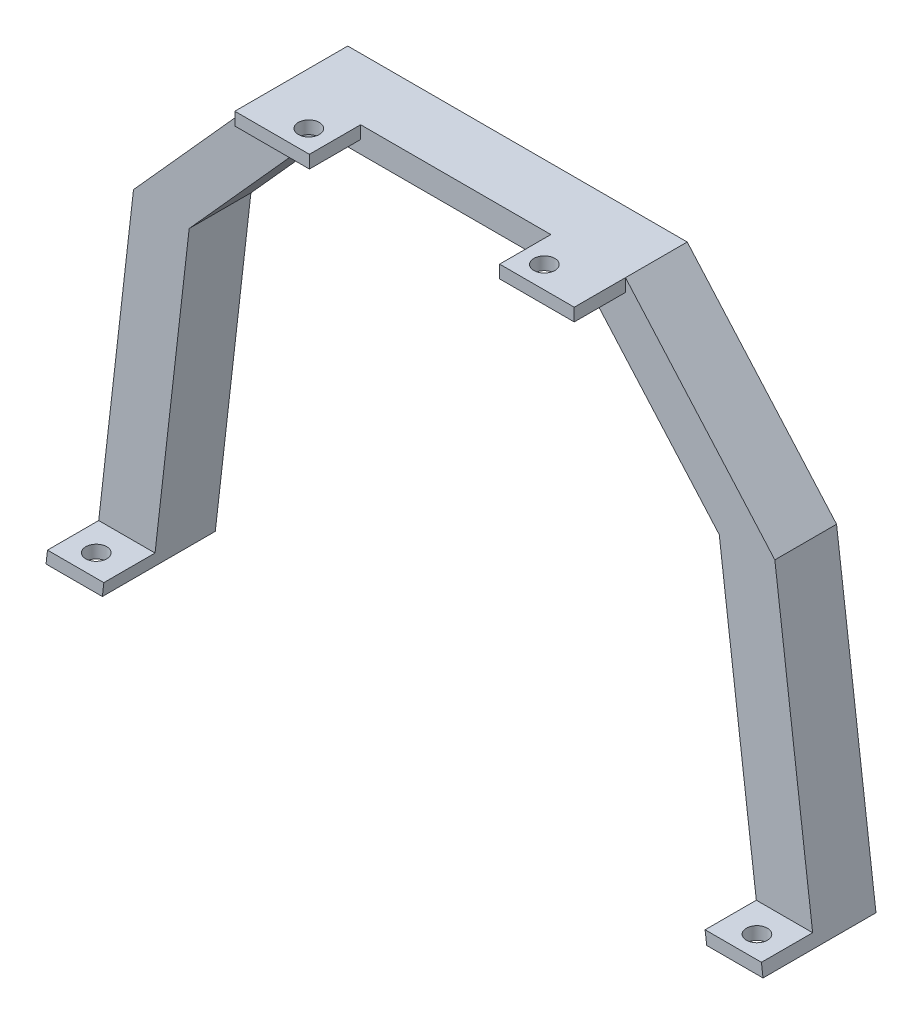
ISO-10303-21;
HEADER;
FILE_DESCRIPTION(('STEP AP214'),'2;1');
FILE_NAME('part.step','',(''),(''),'','','');
FILE_SCHEMA(('AUTOMOTIVE_DESIGN { 1 0 10303 214 1 1 1 1 }'));
ENDSEC;
DATA;
#1=APPLICATION_CONTEXT('core data for automotive mechanical design processes');
#2=APPLICATION_PROTOCOL_DEFINITION('international standard','automotive_design',2000,#1);
#3=PRODUCT_CONTEXT('',#1,'mechanical');
#4=PRODUCT('Part','Part','',(#3));
#5=PRODUCT_RELATED_PRODUCT_CATEGORY('part','',(#4));
#6=PRODUCT_DEFINITION_FORMATION('','',#4);
#7=PRODUCT_DEFINITION_CONTEXT('part definition',#1,'design');
#8=PRODUCT_DEFINITION('design','',#6,#7);
#9=PRODUCT_DEFINITION_SHAPE('','',#8);
#10=(LENGTH_UNIT() NAMED_UNIT(*) SI_UNIT(.MILLI.,.METRE.));
#11=(NAMED_UNIT(*) PLANE_ANGLE_UNIT() SI_UNIT($,.RADIAN.));
#12=(NAMED_UNIT(*) SI_UNIT($,.STERADIAN.) SOLID_ANGLE_UNIT());
#13=UNCERTAINTY_MEASURE_WITH_UNIT(LENGTH_MEASURE(1.E-05),#10,'distance_accuracy_value','');
#14=(GEOMETRIC_REPRESENTATION_CONTEXT(3) GLOBAL_UNCERTAINTY_ASSIGNED_CONTEXT((#13)) GLOBAL_UNIT_ASSIGNED_CONTEXT((#10,
#11,#12)) REPRESENTATION_CONTEXT('',''));
#15=CARTESIAN_POINT('',(0.,0.,0.));
#16=DIRECTION('',(0.,0.,1.));
#17=DIRECTION('',(1.,0.,0.));
#18=AXIS2_PLACEMENT_3D('',#15,#16,#17);
#19=CARTESIAN_POINT('',(25.8602318139897,95.,-2.05512577458606));
#20=DIRECTION('',(0.,1.,0.));
#21=DIRECTION('',(-1.,0.,0.));
#22=AXIS2_PLACEMENT_3D('',#19,#20,#21);
#23=PLANE('',#22);
#24=CARTESIAN_POINT('',(82.,95.,15.6873727087576));
#25=DIRECTION('',(0.,1.,0.));
#26=DIRECTION('',(0.,0.,1.));
#27=AXIS2_PLACEMENT_3D('',#24,#25,#26);
#28=CIRCLE('',#27,2.04999999999999);
#29=CARTESIAN_POINT('',(82.,95.,17.7373727087576));
#30=VERTEX_POINT('',#29);
#31=EDGE_CURVE('E394',#30,#30,#28,.F.);
#32=ORIENTED_EDGE('',*,*,#31,.T.);
#33=EDGE_LOOP('',(#32));
#34=FACE_BOUND('',#33,.T.);
#35=DIRECTION('',(0.,0.,1.));
#36=VECTOR('',#35,1.);
#37=CARTESIAN_POINT('',(25.8602318139897,95.,-2.05512577458606));
#38=LINE('',#37,#36);
#39=CARTESIAN_POINT('',(25.8602318139897,95.,-2.05512577458606));
#40=VERTEX_POINT('',#39);
#41=CARTESIAN_POINT('',(25.8602318139897,95.,10.));
#42=VERTEX_POINT('',#41);
#43=EDGE_CURVE('E369',#40,#42,#38,.T.);
#44=ORIENTED_EDGE('',*,*,#43,.T.);
#45=DIRECTION('',(0.,0.,-1.));
#46=VECTOR('',#45,1.);
#47=CARTESIAN_POINT('',(25.8602318139897,95.,20.));
#48=LINE('',#47,#46);
#49=CARTESIAN_POINT('',(25.8602318139897,95.,20.));
#50=VERTEX_POINT('',#49);
#51=EDGE_CURVE('E243',#50,#42,#48,.T.);
#52=ORIENTED_EDGE('',*,*,#51,.F.);
#53=DIRECTION('',(1.,0.,0.));
#54=VECTOR('',#53,1.);
#55=CARTESIAN_POINT('',(25.8602318139897,95.,20.));
#56=LINE('',#55,#54);
#57=CARTESIAN_POINT('',(40.428513699139,95.,20.));
#58=VERTEX_POINT('',#57);
#59=EDGE_CURVE('E241',#50,#58,#56,.T.);
#60=ORIENTED_EDGE('',*,*,#59,.T.);
#61=DIRECTION('',(0.,0.,-1.));
#62=VECTOR('',#61,1.);
#63=CARTESIAN_POINT('',(40.428513699139,95.,20.));
#64=LINE('',#63,#62);
#65=CARTESIAN_POINT('',(40.428513699139,95.,10.));
#66=VERTEX_POINT('',#65);
#67=EDGE_CURVE('E198',#58,#66,#64,.T.);
#68=ORIENTED_EDGE('',*,*,#67,.T.);
#69=DIRECTION('',(-1.,0.,0.));
#70=VECTOR('',#69,1.);
#71=CARTESIAN_POINT('',(25.8602318139897,95.,10.));
#72=LINE('',#71,#70);
#73=CARTESIAN_POINT('',(77.571486300861,95.,10.));
#74=VERTEX_POINT('',#73);
#75=EDGE_CURVE('E190',#74,#66,#72,.T.);
#76=ORIENTED_EDGE('',*,*,#75,.F.);
#77=DIRECTION('',(0.,0.,-1.));
#78=VECTOR('',#77,1.);
#79=CARTESIAN_POINT('',(77.571486300861,95.,20.));
#80=LINE('',#79,#78);
#81=CARTESIAN_POINT('',(77.571486300861,95.,20.));
#82=VERTEX_POINT('',#81);
#83=EDGE_CURVE('E195',#82,#74,#80,.T.);
#84=ORIENTED_EDGE('',*,*,#83,.F.);
#85=DIRECTION('',(-1.,0.,0.));
#86=VECTOR('',#85,1.);
#87=CARTESIAN_POINT('',(92.1397681860104,95.,20.));
#88=LINE('',#87,#86);
#89=CARTESIAN_POINT('',(92.1397681860104,95.,20.));
#90=VERTEX_POINT('',#89);
#91=EDGE_CURVE('E224',#90,#82,#88,.T.);
#92=ORIENTED_EDGE('',*,*,#91,.F.);
#93=DIRECTION('',(0.,0.,-1.));
#94=VECTOR('',#93,1.);
#95=CARTESIAN_POINT('',(92.1397681860104,95.,20.));
#96=LINE('',#95,#94);
#97=CARTESIAN_POINT('',(92.1397681860103,95.,10.));
#98=VERTEX_POINT('',#97);
#99=EDGE_CURVE('E213',#90,#98,#96,.T.);
#100=ORIENTED_EDGE('',*,*,#99,.T.);
#101=DIRECTION('',(0.,0.,1.));
#102=VECTOR('',#101,1.);
#103=CARTESIAN_POINT('',(92.1397681860103,95.,-2.05512577458606));
#104=LINE('',#103,#102);
#105=CARTESIAN_POINT('',(92.1397681860103,95.,-2.05512577458606));
#106=VERTEX_POINT('',#105);
#107=EDGE_CURVE('E371',#106,#98,#104,.T.);
#108=ORIENTED_EDGE('',*,*,#107,.F.);
#109=DIRECTION('',(-1.,0.,0.));
#110=VECTOR('',#109,1.);
#111=CARTESIAN_POINT('',(25.8602318139897,95.,-2.05512577458606));
#112=LINE('',#111,#110);
#113=EDGE_CURVE('E353',#106,#40,#112,.T.);
#114=ORIENTED_EDGE('',*,*,#113,.T.);
#115=EDGE_LOOP('',(#44,#52,#60,#68,#76,#84,#92,#100,#108,#114));
#116=FACE_BOUND('',#115,.T.);
#117=CARTESIAN_POINT('',(36.,95.,15.6873727087576));
#118=DIRECTION('',(0.,1.,0.));
#119=DIRECTION('',(0.,0.,1.));
#120=AXIS2_PLACEMENT_3D('',#117,#118,#119);
#121=CIRCLE('',#120,2.04999999999999);
#122=CARTESIAN_POINT('',(36.,95.,17.7373727087576));
#123=VERTEX_POINT('',#122);
#124=EDGE_CURVE('E389',#123,#123,#121,.T.);
#125=ORIENTED_EDGE('',*,*,#124,.F.);
#126=EDGE_LOOP('',(#125));
#127=FACE_BOUND('',#126,.T.);
#128=ADVANCED_FACE('F33',(#34,#116,#127),#23,.T.);
#129=CARTESIAN_POINT('',(0.,0.,10.));
#130=DIRECTION('',(0.,0.,-1.));
#131=DIRECTION('',(-1.,0.,0.));
#132=AXIS2_PLACEMENT_3D('',#129,#130,#131);
#133=PLANE('',#132);
#134=DIRECTION('',(-0.660642973981381,0.750700247055399,0.));
#135=VECTOR('',#134,1.);
#136=CARTESIAN_POINT('',(92.1397681860103,95.,10.));
#137=LINE('',#136,#135);
#138=CARTESIAN_POINT('',(121.306037179639,61.8578548451829,10.));
#139=VERTEX_POINT('',#138);
#140=EDGE_CURVE('E201',#139,#98,#137,.T.);
#141=ORIENTED_EDGE('',*,*,#140,.T.);
#142=DIRECTION('',(0.,-1.,0.));
#143=VECTOR('',#142,1.);
#144=CARTESIAN_POINT('',(92.1397681860104,95.,10.));
#145=LINE('',#144,#143);
#146=CARTESIAN_POINT('',(92.1397681860104,92.5,10.));
#147=VERTEX_POINT('',#146);
#148=EDGE_CURVE('E55',#98,#147,#145,.T.);
#149=ORIENTED_EDGE('',*,*,#148,.T.);
#150=DIRECTION('',(-1.,0.,0.));
#151=VECTOR('',#150,1.);
#152=CARTESIAN_POINT('',(92.1397681860104,92.5,10.));
#153=LINE('',#152,#151);
#154=CARTESIAN_POINT('',(77.571486300861,92.5,10.));
#155=VERTEX_POINT('',#154);
#156=EDGE_CURVE('E50',#147,#155,#153,.T.);
#157=ORIENTED_EDGE('',*,*,#156,.T.);
#158=DIRECTION('',(0.,-1.,0.));
#159=VECTOR('',#158,1.);
#160=CARTESIAN_POINT('',(77.571486300861,95.,10.));
#161=LINE('',#160,#159);
#162=EDGE_CURVE('E204',#74,#155,#161,.T.);
#163=ORIENTED_EDGE('',*,*,#162,.F.);
#164=ORIENTED_EDGE('',*,*,#75,.T.);
#165=DIRECTION('',(0.,-1.,0.));
#166=VECTOR('',#165,1.);
#167=CARTESIAN_POINT('',(40.428513699139,95.,10.));
#168=LINE('',#167,#166);
#169=CARTESIAN_POINT('',(40.428513699139,92.5,10.));
#170=VERTEX_POINT('',#169);
#171=EDGE_CURVE('E236',#66,#170,#168,.T.);
#172=ORIENTED_EDGE('',*,*,#171,.T.);
#173=DIRECTION('',(1.,0.,0.));
#174=VECTOR('',#173,1.);
#175=CARTESIAN_POINT('',(25.8602318139897,92.5,10.));
#176=LINE('',#175,#174);
#177=CARTESIAN_POINT('',(25.8602318139897,92.5,10.));
#178=VERTEX_POINT('',#177);
#179=EDGE_CURVE('E246',#178,#170,#176,.T.);
#180=ORIENTED_EDGE('',*,*,#179,.F.);
#181=DIRECTION('',(0.,-1.,0.));
#182=VECTOR('',#181,1.);
#183=CARTESIAN_POINT('',(25.8602318139897,95.,10.));
#184=LINE('',#183,#182);
#185=EDGE_CURVE('E223',#42,#178,#184,.T.);
#186=ORIENTED_EDGE('',*,*,#185,.F.);
#187=DIRECTION('',(-0.668330973625372,-0.743864039790177,0.));
#188=VECTOR('',#187,1.);
#189=CARTESIAN_POINT('',(-3.91661039712217,61.8578548451829,10.));
#190=LINE('',#189,#188);
#191=CARTESIAN_POINT('',(-3.91661039712217,61.8578548451829,10.));
#192=VERTEX_POINT('',#191);
#193=EDGE_CURVE('E200',#42,#192,#190,.T.);
#194=ORIENTED_EDGE('',*,*,#193,.T.);
#195=DIRECTION('',(-0.11376728448492,-0.993507425730139,0.));
#196=VECTOR('',#195,1.);
#197=CARTESIAN_POINT('',(-11.,0.,10.));
#198=LINE('',#197,#196);
#199=CARTESIAN_POINT('',(-10.7137231148491,2.5,10.));
#200=VERTEX_POINT('',#199);
#201=EDGE_CURVE('E327',#192,#200,#198,.T.);
#202=ORIENTED_EDGE('',*,*,#201,.T.);
#203=DIRECTION('',(-1.,0.,0.));
#204=VECTOR('',#203,1.);
#205=CARTESIAN_POINT('',(0.286276885150886,2.5,10.));
#206=LINE('',#205,#204);
#207=CARTESIAN_POINT('',(0.286276885150885,2.5,10.));
#208=VERTEX_POINT('',#207);
#209=EDGE_CURVE('E290',#208,#200,#206,.T.);
#210=ORIENTED_EDGE('',*,*,#209,.F.);
#211=DIRECTION('',(0.11376728448492,0.993507425730139,0.));
#212=VECTOR('',#211,1.);
#213=CARTESIAN_POINT('',(0.,0.,10.));
#214=LINE('',#213,#212);
#215=CARTESIAN_POINT('',(6.95184749138997,60.7091233346164,10.));
#216=VERTEX_POINT('',#215);
#217=EDGE_CURVE('E309',#208,#216,#214,.T.);
#218=ORIENTED_EDGE('',*,*,#217,.T.);
#219=DIRECTION('',(0.668330973625372,0.743864039790177,0.));
#220=VECTOR('',#219,1.);
#221=CARTESIAN_POINT('',(6.95184749138997,60.7091233346164,10.));
#222=LINE('',#221,#220);
#223=CARTESIAN_POINT('',(33.2684847704798,90.,10.));
#224=VERTEX_POINT('',#223);
#225=EDGE_CURVE('E311',#216,#224,#222,.T.);
#226=ORIENTED_EDGE('',*,*,#225,.T.);
#227=DIRECTION('',(1.,0.,0.));
#228=VECTOR('',#227,1.);
#229=CARTESIAN_POINT('',(33.2684847704798,90.,10.));
#230=LINE('',#229,#228);
#231=CARTESIAN_POINT('',(84.671902487777,90.,10.));
#232=VERTEX_POINT('',#231);
#233=EDGE_CURVE('E314',#224,#232,#230,.T.);
#234=ORIENTED_EDGE('',*,*,#233,.T.);
#235=DIRECTION('',(0.660642973981381,-0.750700247055399,0.));
#236=VECTOR('',#235,1.);
#237=CARTESIAN_POINT('',(84.671902487777,90.,10.));
#238=LINE('',#237,#236);
#239=CARTESIAN_POINT('',(110.448917943205,60.7091233346164,10.));
#240=VERTEX_POINT('',#239);
#241=EDGE_CURVE('E317',#232,#240,#238,.T.);
#242=ORIENTED_EDGE('',*,*,#241,.T.);
#243=DIRECTION('',(0.123430226510068,-0.992353253223706,0.));
#244=VECTOR('',#243,1.);
#245=CARTESIAN_POINT('',(110.448917943205,60.7091233346164,10.));
#246=LINE('',#245,#244);
#247=CARTESIAN_POINT('',(117.689046652215,2.5,10.));
#248=VERTEX_POINT('',#247);
#249=EDGE_CURVE('E320',#240,#248,#246,.T.);
#250=ORIENTED_EDGE('',*,*,#249,.T.);
#251=DIRECTION('',(-1.,0.,0.));
#252=VECTOR('',#251,1.);
#253=CARTESIAN_POINT('',(128.689046652215,2.5,10.));
#254=LINE('',#253,#252);
#255=CARTESIAN_POINT('',(128.689046652215,2.5,10.));
#256=VERTEX_POINT('',#255);
#257=EDGE_CURVE('E271',#256,#248,#254,.T.);
#258=ORIENTED_EDGE('',*,*,#257,.F.);
#259=DIRECTION('',(-0.123430226510069,0.992353253223706,0.));
#260=VECTOR('',#259,1.);
#261=CARTESIAN_POINT('',(121.306037179639,61.8578548451829,10.));
#262=LINE('',#261,#260);
#263=EDGE_CURVE('E322',#256,#139,#262,.T.);
#264=ORIENTED_EDGE('',*,*,#263,.T.);
#265=EDGE_LOOP('',(#141,#149,#157,#163,#164,#172,#180,#186,#194,#202,#210,#218,#226,#234,#242,
#250,#258,#264));
#266=FACE_BOUND('',#265,.T.);
#267=ADVANCED_FACE('F205',(#266),#133,.F.);
#268=CARTESIAN_POINT('',(0.,0.,-2.05512577458606));
#269=DIRECTION('',(0.993507425730139,-0.113767284484919,0.));
#270=DIRECTION('',(0.11376728448492,0.993507425730139,0.));
#271=AXIS2_PLACEMENT_3D('',#268,#269,#270);
#272=PLANE('',#271);
#273=DIRECTION('',(0.,0.,1.));
#274=VECTOR('',#273,1.);
#275=CARTESIAN_POINT('',(6.95184749138997,60.7091233346164,-2.05512577458606));
#276=LINE('',#275,#274);
#277=CARTESIAN_POINT('',(6.95184749138997,60.7091233346164,-2.05512577458606));
#278=VERTEX_POINT('',#277);
#279=EDGE_CURVE('E364',#278,#216,#276,.T.);
#280=ORIENTED_EDGE('',*,*,#279,.T.);
#281=ORIENTED_EDGE('',*,*,#217,.F.);
#282=DIRECTION('',(0.,0.,-1.));
#283=VECTOR('',#282,1.);
#284=CARTESIAN_POINT('',(0.286276885150886,2.5,20.));
#285=LINE('',#284,#283);
#286=CARTESIAN_POINT('',(0.286276885150886,2.5,20.));
#287=VERTEX_POINT('',#286);
#288=EDGE_CURVE('E306',#287,#208,#285,.T.);
#289=ORIENTED_EDGE('',*,*,#288,.F.);
#290=DIRECTION('',(0.11376728448492,0.993507425730139,0.));
#291=VECTOR('',#290,1.);
#292=CARTESIAN_POINT('',(0.,0.,20.));
#293=LINE('',#292,#291);
#294=CARTESIAN_POINT('',(0.,0.,20.));
#295=VERTEX_POINT('',#294);
#296=EDGE_CURVE('E297',#295,#287,#293,.T.);
#297=ORIENTED_EDGE('',*,*,#296,.F.);
#298=DIRECTION('',(0.,0.,1.));
#299=VECTOR('',#298,1.);
#300=CARTESIAN_POINT('',(0.,0.,-2.05512577458606));
#301=LINE('',#300,#299);
#302=CARTESIAN_POINT('',(0.,0.,-2.05512577458606));
#303=VERTEX_POINT('',#302);
#304=EDGE_CURVE('E11',#303,#295,#301,.T.);
#305=ORIENTED_EDGE('',*,*,#304,.F.);
#306=DIRECTION('',(0.11376728448492,0.993507425730139,0.));
#307=VECTOR('',#306,1.);
#308=CARTESIAN_POINT('',(0.,0.,-2.05512577458606));
#309=LINE('',#308,#307);
#310=EDGE_CURVE('E329',#303,#278,#309,.T.);
#311=ORIENTED_EDGE('',*,*,#310,.T.);
#312=EDGE_LOOP('',(#280,#281,#289,#297,#305,#311));
#313=FACE_BOUND('',#312,.T.);
#314=ADVANCED_FACE('F35',(#313),#272,.T.);
#315=CARTESIAN_POINT('',(0.,0.,-2.05512577458606));
#316=DIRECTION('',(0.,-1.,0.));
#317=DIRECTION('',(1.,0.,0.));
#318=AXIS2_PLACEMENT_3D('',#315,#316,#317);
#319=PLANE('',#318);
#320=CARTESIAN_POINT('',(-5.5,0.,15.6873727087576));
#321=DIRECTION('',(0.,-1.,0.));
#322=DIRECTION('',(1.,0.,0.));
#323=AXIS2_PLACEMENT_3D('',#320,#321,#322);
#324=CIRCLE('',#323,2.05);
#325=CARTESIAN_POINT('',(-3.45,0.,15.6873727087576));
#326=VERTEX_POINT('',#325);
#327=EDGE_CURVE('E268',#326,#326,#324,.T.);
#328=ORIENTED_EDGE('',*,*,#327,.F.);
#329=EDGE_LOOP('',(#328));
#330=FACE_BOUND('',#329,.T.);
#331=ORIENTED_EDGE('',*,*,#304,.T.);
#332=DIRECTION('',(1.,0.,0.));
#333=VECTOR('',#332,1.);
#334=CARTESIAN_POINT('',(-11.,0.,20.));
#335=LINE('',#334,#333);
#336=CARTESIAN_POINT('',(-11.,0.,20.));
#337=VERTEX_POINT('',#336);
#338=EDGE_CURVE('E294',#337,#295,#335,.T.);
#339=ORIENTED_EDGE('',*,*,#338,.F.);
#340=DIRECTION('',(0.,0.,1.));
#341=VECTOR('',#340,1.);
#342=CARTESIAN_POINT('',(-11.,0.,-2.05512577458606));
#343=LINE('',#342,#341);
#344=CARTESIAN_POINT('',(-11.,0.,-2.05512577458606));
#345=VERTEX_POINT('',#344);
#346=EDGE_CURVE('E42',#345,#337,#343,.T.);
#347=ORIENTED_EDGE('',*,*,#346,.F.);
#348=DIRECTION('',(1.,0.,0.));
#349=VECTOR('',#348,1.);
#350=CARTESIAN_POINT('',(0.,0.,-2.05512577458606));
#351=LINE('',#350,#349);
#352=EDGE_CURVE('E362',#345,#303,#351,.T.);
#353=ORIENTED_EDGE('',*,*,#352,.T.);
#354=EDGE_LOOP('',(#331,#339,#347,#353));
#355=FACE_BOUND('',#354,.T.);
#356=ADVANCED_FACE('F452',(#330,#355),#319,.T.);
#357=CARTESIAN_POINT('',(-11.,0.,-2.05512577458606));
#358=DIRECTION('',(-0.993507425730139,0.11376728448492,0.));
#359=DIRECTION('',(-0.11376728448492,-0.993507425730139,0.));
#360=AXIS2_PLACEMENT_3D('',#357,#358,#359);
#361=PLANE('',#360);
#362=ORIENTED_EDGE('',*,*,#346,.T.);
#363=DIRECTION('',(-0.113767284484921,-0.993507425730139,0.));
#364=VECTOR('',#363,1.);
#365=CARTESIAN_POINT('',(-10.7137231148491,2.5,20.));
#366=LINE('',#365,#364);
#367=CARTESIAN_POINT('',(-10.7137231148491,2.5,20.));
#368=VERTEX_POINT('',#367);
#369=EDGE_CURVE('E291',#368,#337,#366,.T.);
#370=ORIENTED_EDGE('',*,*,#369,.F.);
#371=DIRECTION('',(0.,0.,-1.));
#372=VECTOR('',#371,1.);
#373=CARTESIAN_POINT('',(-10.7137231148491,2.5,20.));
#374=LINE('',#373,#372);
#375=EDGE_CURVE('E301',#368,#200,#374,.T.);
#376=ORIENTED_EDGE('',*,*,#375,.T.);
#377=ORIENTED_EDGE('',*,*,#201,.F.);
#378=DIRECTION('',(0.,0.,1.));
#379=VECTOR('',#378,1.);
#380=CARTESIAN_POINT('',(-3.91661039712217,61.8578548451829,-2.05512577458606));
#381=LINE('',#380,#379);
#382=CARTESIAN_POINT('',(-3.91661039712217,61.8578548451829,-2.05512577458606));
#383=VERTEX_POINT('',#382);
#384=EDGE_CURVE('E367',#383,#192,#381,.T.);
#385=ORIENTED_EDGE('',*,*,#384,.F.);
#386=DIRECTION('',(-0.11376728448492,-0.993507425730139,0.));
#387=VECTOR('',#386,1.);
#388=CARTESIAN_POINT('',(-11.,0.,-2.05512577458606));
#389=LINE('',#388,#387);
#390=EDGE_CURVE('E359',#383,#345,#389,.T.);
#391=ORIENTED_EDGE('',*,*,#390,.T.);
#392=EDGE_LOOP('',(#362,#370,#376,#377,#385,#391));
#393=FACE_BOUND('',#392,.T.);
#394=ADVANCED_FACE('F459',(#393),#361,.T.);
#395=CARTESIAN_POINT('',(-3.91661039712217,61.8578548451829,-2.05512577458606));
#396=DIRECTION('',(-0.743864039790177,0.668330973625372,0.));
#397=DIRECTION('',(-0.668330973625372,-0.743864039790177,0.));
#398=AXIS2_PLACEMENT_3D('',#395,#396,#397);
#399=PLANE('',#398);
#400=ORIENTED_EDGE('',*,*,#384,.T.);
#401=ORIENTED_EDGE('',*,*,#193,.F.);
#402=ORIENTED_EDGE('',*,*,#43,.F.);
#403=DIRECTION('',(-0.668330973625372,-0.743864039790177,0.));
#404=VECTOR('',#403,1.);
#405=CARTESIAN_POINT('',(-3.91661039712217,61.8578548451829,-2.05512577458606));
#406=LINE('',#405,#404);
#407=EDGE_CURVE('E356',#40,#383,#406,.T.);
#408=ORIENTED_EDGE('',*,*,#407,.T.);
#409=EDGE_LOOP('',(#400,#401,#402,#408));
#410=FACE_BOUND('',#409,.T.);
#411=ADVANCED_FACE('F462',(#410),#399,.T.);
#412=CARTESIAN_POINT('',(92.1397681860103,95.,-2.05512577458606));
#413=DIRECTION('',(0.750700247055399,0.660642973981381,0.));
#414=DIRECTION('',(-0.660642973981381,0.750700247055399,0.));
#415=AXIS2_PLACEMENT_3D('',#412,#413,#414);
#416=PLANE('',#415);
#417=ORIENTED_EDGE('',*,*,#107,.T.);
#418=ORIENTED_EDGE('',*,*,#140,.F.);
#419=DIRECTION('',(0.,0.,1.));
#420=VECTOR('',#419,1.);
#421=CARTESIAN_POINT('',(121.306037179639,61.8578548451829,-2.05512577458606));
#422=LINE('',#421,#420);
#423=CARTESIAN_POINT('',(121.306037179639,61.8578548451829,-2.05512577458606));
#424=VERTEX_POINT('',#423);
#425=EDGE_CURVE('E373',#424,#139,#422,.T.);
#426=ORIENTED_EDGE('',*,*,#425,.F.);
#427=DIRECTION('',(-0.660642973981381,0.750700247055399,0.));
#428=VECTOR('',#427,1.);
#429=CARTESIAN_POINT('',(92.1397681860103,95.,-2.05512577458606));
#430=LINE('',#429,#428);
#431=EDGE_CURVE('E350',#424,#106,#430,.T.);
#432=ORIENTED_EDGE('',*,*,#431,.T.);
#433=EDGE_LOOP('',(#417,#418,#426,#432));
#434=FACE_BOUND('',#433,.T.);
#435=ADVANCED_FACE('F418',(#434),#416,.T.);
#436=CARTESIAN_POINT('',(121.306037179639,61.8578548451829,-2.05512577458606));
#437=DIRECTION('',(0.992353253223706,0.123430226510069,0.));
#438=DIRECTION('',(-0.123430226510069,0.992353253223706,0.));
#439=AXIS2_PLACEMENT_3D('',#436,#437,#438);
#440=PLANE('',#439);
#441=ORIENTED_EDGE('',*,*,#425,.T.);
#442=ORIENTED_EDGE('',*,*,#263,.F.);
#443=DIRECTION('',(0.,0.,-1.));
#444=VECTOR('',#443,1.);
#445=CARTESIAN_POINT('',(128.689046652215,2.5,20.));
#446=LINE('',#445,#444);
#447=CARTESIAN_POINT('',(128.689046652215,2.5,20.));
#448=VERTEX_POINT('',#447);
#449=EDGE_CURVE('E287',#448,#256,#446,.T.);
#450=ORIENTED_EDGE('',*,*,#449,.F.);
#451=DIRECTION('',(-0.123430226510066,0.992353253223706,0.));
#452=VECTOR('',#451,1.);
#453=CARTESIAN_POINT('',(129.,0.,20.));
#454=LINE('',#453,#452);
#455=CARTESIAN_POINT('',(129.,0.,20.));
#456=VERTEX_POINT('',#455);
#457=EDGE_CURVE('E278',#456,#448,#454,.T.);
#458=ORIENTED_EDGE('',*,*,#457,.F.);
#459=DIRECTION('',(0.,0.,1.));
#460=VECTOR('',#459,1.);
#461=CARTESIAN_POINT('',(129.,0.,-2.05512577458606));
#462=LINE('',#461,#460);
#463=CARTESIAN_POINT('',(129.,0.,-2.05512577458606));
#464=VERTEX_POINT('',#463);
#465=EDGE_CURVE('E376',#464,#456,#462,.T.);
#466=ORIENTED_EDGE('',*,*,#465,.F.);
#467=DIRECTION('',(-0.123430226510069,0.992353253223706,0.));
#468=VECTOR('',#467,1.);
#469=CARTESIAN_POINT('',(121.306037179639,61.8578548451829,-2.05512577458606));
#470=LINE('',#469,#468);
#471=EDGE_CURVE('E347',#464,#424,#470,.T.);
#472=ORIENTED_EDGE('',*,*,#471,.T.);
#473=EDGE_LOOP('',(#441,#442,#450,#458,#466,#472));
#474=FACE_BOUND('',#473,.T.);
#475=ADVANCED_FACE('F421',(#474),#440,.T.);
#476=CARTESIAN_POINT('',(118.,0.,-2.05512577458606));
#477=DIRECTION('',(0.,-1.,0.));
#478=DIRECTION('',(0.,0.,-1.));
#479=AXIS2_PLACEMENT_3D('',#476,#477,#478);
#480=PLANE('',#479);
#481=CARTESIAN_POINT('',(123.5,0.,15.6873727087576));
#482=DIRECTION('',(0.,-1.,0.));
#483=DIRECTION('',(0.,0.,-1.));
#484=AXIS2_PLACEMENT_3D('',#481,#482,#483);
#485=CIRCLE('',#484,2.04999999999999);
#486=CARTESIAN_POINT('',(123.5,0.,13.6373727087576));
#487=VERTEX_POINT('',#486);
#488=EDGE_CURVE('E263',#487,#487,#485,.T.);
#489=ORIENTED_EDGE('',*,*,#488,.F.);
#490=EDGE_LOOP('',(#489));
#491=FACE_BOUND('',#490,.T.);
#492=ORIENTED_EDGE('',*,*,#465,.T.);
#493=DIRECTION('',(1.,0.,0.));
#494=VECTOR('',#493,1.);
#495=CARTESIAN_POINT('',(118.,0.,20.));
#496=LINE('',#495,#494);
#497=CARTESIAN_POINT('',(118.,0.,20.));
#498=VERTEX_POINT('',#497);
#499=EDGE_CURVE('E275',#498,#456,#496,.T.);
#500=ORIENTED_EDGE('',*,*,#499,.F.);
#501=DIRECTION('',(0.,0.,1.));
#502=VECTOR('',#501,1.);
#503=CARTESIAN_POINT('',(118.,0.,-2.05512577458606));
#504=LINE('',#503,#502);
#505=CARTESIAN_POINT('',(118.,0.,-2.05512577458606));
#506=VERTEX_POINT('',#505);
#507=EDGE_CURVE('E378',#506,#498,#504,.T.);
#508=ORIENTED_EDGE('',*,*,#507,.F.);
#509=DIRECTION('',(1.,0.,0.));
#510=VECTOR('',#509,1.);
#511=CARTESIAN_POINT('',(118.,0.,-2.05512577458606));
#512=LINE('',#511,#510);
#513=EDGE_CURVE('E344',#506,#464,#512,.T.);
#514=ORIENTED_EDGE('',*,*,#513,.T.);
#515=EDGE_LOOP('',(#492,#500,#508,#514));
#516=FACE_BOUND('',#515,.T.);
#517=ADVANCED_FACE('F427',(#491,#516),#480,.T.);
#518=CARTESIAN_POINT('',(110.448917943205,60.7091233346164,-2.05512577458606));
#519=DIRECTION('',(-0.992353253223706,-0.123430226510068,0.));
#520=DIRECTION('',(0.123430226510068,-0.992353253223706,0.));
#521=AXIS2_PLACEMENT_3D('',#518,#519,#520);
#522=PLANE('',#521);
#523=ORIENTED_EDGE('',*,*,#507,.T.);
#524=DIRECTION('',(0.123430226510066,-0.992353253223707,0.));
#525=VECTOR('',#524,1.);
#526=CARTESIAN_POINT('',(117.689046652215,2.5,20.));
#527=LINE('',#526,#525);
#528=CARTESIAN_POINT('',(117.689046652215,2.5,20.));
#529=VERTEX_POINT('',#528);
#530=EDGE_CURVE('E272',#529,#498,#527,.T.);
#531=ORIENTED_EDGE('',*,*,#530,.F.);
#532=DIRECTION('',(0.,0.,-1.));
#533=VECTOR('',#532,1.);
#534=CARTESIAN_POINT('',(117.689046652215,2.5,20.));
#535=LINE('',#534,#533);
#536=EDGE_CURVE('E282',#529,#248,#535,.T.);
#537=ORIENTED_EDGE('',*,*,#536,.T.);
#538=ORIENTED_EDGE('',*,*,#249,.F.);
#539=DIRECTION('',(0.,0.,1.));
#540=VECTOR('',#539,1.);
#541=CARTESIAN_POINT('',(110.448917943205,60.7091233346164,-2.05512577458606));
#542=LINE('',#541,#540);
#543=CARTESIAN_POINT('',(110.448917943205,60.7091233346164,-2.05512577458606));
#544=VERTEX_POINT('',#543);
#545=EDGE_CURVE('E380',#544,#240,#542,.T.);
#546=ORIENTED_EDGE('',*,*,#545,.F.);
#547=DIRECTION('',(0.123430226510068,-0.992353253223706,0.));
#548=VECTOR('',#547,1.);
#549=CARTESIAN_POINT('',(110.448917943205,60.7091233346164,-2.05512577458606));
#550=LINE('',#549,#548);
#551=EDGE_CURVE('E341',#544,#506,#550,.T.);
#552=ORIENTED_EDGE('',*,*,#551,.T.);
#553=EDGE_LOOP('',(#523,#531,#537,#538,#546,#552));
#554=FACE_BOUND('',#553,.T.);
#555=ADVANCED_FACE('F431',(#554),#522,.T.);
#556=CARTESIAN_POINT('',(84.671902487777,90.,-2.05512577458606));
#557=DIRECTION('',(-0.750700247055399,-0.660642973981381,0.));
#558=DIRECTION('',(0.660642973981381,-0.750700247055399,0.));
#559=AXIS2_PLACEMENT_3D('',#556,#557,#558);
#560=PLANE('',#559);
#561=ORIENTED_EDGE('',*,*,#545,.T.);
#562=ORIENTED_EDGE('',*,*,#241,.F.);
#563=DIRECTION('',(0.,0.,1.));
#564=VECTOR('',#563,1.);
#565=CARTESIAN_POINT('',(84.671902487777,90.,-2.05512577458606));
#566=LINE('',#565,#564);
#567=CARTESIAN_POINT('',(84.671902487777,90.,-2.05512577458606));
#568=VERTEX_POINT('',#567);
#569=EDGE_CURVE('E382',#568,#232,#566,.T.);
#570=ORIENTED_EDGE('',*,*,#569,.F.);
#571=DIRECTION('',(0.660642973981381,-0.750700247055399,0.));
#572=VECTOR('',#571,1.);
#573=CARTESIAN_POINT('',(84.671902487777,90.,-2.05512577458606));
#574=LINE('',#573,#572);
#575=EDGE_CURVE('E338',#568,#544,#574,.T.);
#576=ORIENTED_EDGE('',*,*,#575,.T.);
#577=EDGE_LOOP('',(#561,#562,#570,#576));
#578=FACE_BOUND('',#577,.T.);
#579=ADVANCED_FACE('F436',(#578),#560,.T.);
#580=CARTESIAN_POINT('',(33.2684847704798,90.,-2.05512577458606));
#581=DIRECTION('',(0.,-1.,0.));
#582=DIRECTION('',(1.,0.,0.));
#583=AXIS2_PLACEMENT_3D('',#580,#581,#582);
#584=PLANE('',#583);
#585=ORIENTED_EDGE('',*,*,#569,.T.);
#586=ORIENTED_EDGE('',*,*,#233,.F.);
#587=DIRECTION('',(0.,0.,1.));
#588=VECTOR('',#587,1.);
#589=CARTESIAN_POINT('',(33.2684847704798,90.,-2.05512577458606));
#590=LINE('',#589,#588);
#591=CARTESIAN_POINT('',(33.2684847704798,90.,-2.05512577458606));
#592=VERTEX_POINT('',#591);
#593=EDGE_CURVE('E384',#592,#224,#590,.T.);
#594=ORIENTED_EDGE('',*,*,#593,.F.);
#595=DIRECTION('',(1.,0.,0.));
#596=VECTOR('',#595,1.);
#597=CARTESIAN_POINT('',(33.2684847704798,90.,-2.05512577458606));
#598=LINE('',#597,#596);
#599=EDGE_CURVE('E335',#592,#568,#598,.T.);
#600=ORIENTED_EDGE('',*,*,#599,.T.);
#601=EDGE_LOOP('',(#585,#586,#594,#600));
#602=FACE_BOUND('',#601,.T.);
#603=ADVANCED_FACE('F440',(#602),#584,.T.);
#604=CARTESIAN_POINT('',(6.95184749138997,60.7091233346164,-2.05512577458606));
#605=DIRECTION('',(0.743864039790177,-0.668330973625372,0.));
#606=DIRECTION('',(0.668330973625372,0.743864039790177,0.));
#607=AXIS2_PLACEMENT_3D('',#604,#605,#606);
#608=PLANE('',#607);
#609=ORIENTED_EDGE('',*,*,#593,.T.);
#610=ORIENTED_EDGE('',*,*,#225,.F.);
#611=ORIENTED_EDGE('',*,*,#279,.F.);
#612=DIRECTION('',(0.668330973625372,0.743864039790177,0.));
#613=VECTOR('',#612,1.);
#614=CARTESIAN_POINT('',(6.95184749138997,60.7091233346164,-2.05512577458606));
#615=LINE('',#614,#613);
#616=EDGE_CURVE('E332',#278,#592,#615,.T.);
#617=ORIENTED_EDGE('',*,*,#616,.T.);
#618=EDGE_LOOP('',(#609,#610,#611,#617));
#619=FACE_BOUND('',#618,.T.);
#620=ADVANCED_FACE('F444',(#619),#608,.T.);
#621=CARTESIAN_POINT('',(0.,0.,-2.05512577458606));
#622=DIRECTION('',(0.,0.,-1.));
#623=DIRECTION('',(-1.,0.,0.));
#624=AXIS2_PLACEMENT_3D('',#621,#622,#623);
#625=PLANE('',#624);
#626=ORIENTED_EDGE('',*,*,#310,.F.);
#627=ORIENTED_EDGE('',*,*,#352,.F.);
#628=ORIENTED_EDGE('',*,*,#390,.F.);
#629=ORIENTED_EDGE('',*,*,#407,.F.);
#630=ORIENTED_EDGE('',*,*,#113,.F.);
#631=ORIENTED_EDGE('',*,*,#431,.F.);
#632=ORIENTED_EDGE('',*,*,#471,.F.);
#633=ORIENTED_EDGE('',*,*,#513,.F.);
#634=ORIENTED_EDGE('',*,*,#551,.F.);
#635=ORIENTED_EDGE('',*,*,#575,.F.);
#636=ORIENTED_EDGE('',*,*,#599,.F.);
#637=ORIENTED_EDGE('',*,*,#616,.F.);
#638=EDGE_LOOP('',(#626,#627,#628,#629,#630,#631,#632,#633,#634,#635,#636,#637));
#639=FACE_BOUND('',#638,.T.);
#640=ADVANCED_FACE('F415',(#639),#625,.T.);
#641=CARTESIAN_POINT('',(0.286276885150886,2.5,20.));
#642=DIRECTION('',(0.,-1.,0.));
#643=DIRECTION('',(1.,0.,0.));
#644=AXIS2_PLACEMENT_3D('',#641,#642,#643);
#645=PLANE('',#644);
#646=CARTESIAN_POINT('',(-5.5,2.5,15.6873727087576));
#647=DIRECTION('',(0.,1.,0.));
#648=DIRECTION('',(-1.,0.,0.));
#649=AXIS2_PLACEMENT_3D('',#646,#647,#648);
#650=CIRCLE('',#649,2.05);
#651=CARTESIAN_POINT('',(-7.55,2.5,15.6873727087576));
#652=VERTEX_POINT('',#651);
#653=EDGE_CURVE('E260',#652,#652,#650,.T.);
#654=ORIENTED_EDGE('',*,*,#653,.F.);
#655=EDGE_LOOP('',(#654));
#656=FACE_BOUND('',#655,.T.);
#657=ORIENTED_EDGE('',*,*,#209,.T.);
#658=ORIENTED_EDGE('',*,*,#375,.F.);
#659=DIRECTION('',(-1.,0.,0.));
#660=VECTOR('',#659,1.);
#661=CARTESIAN_POINT('',(0.286276885150886,2.5,20.));
#662=LINE('',#661,#660);
#663=EDGE_CURVE('E299',#287,#368,#662,.T.);
#664=ORIENTED_EDGE('',*,*,#663,.F.);
#665=ORIENTED_EDGE('',*,*,#288,.T.);
#666=EDGE_LOOP('',(#657,#658,#664,#665));
#667=FACE_BOUND('',#666,.T.);
#668=ADVANCED_FACE('F513',(#656,#667),#645,.F.);
#669=CARTESIAN_POINT('',(0.,0.,20.));
#670=DIRECTION('',(0.,0.,1.));
#671=DIRECTION('',(1.,0.,0.));
#672=AXIS2_PLACEMENT_3D('',#669,#670,#671);
#673=PLANE('',#672);
#674=ORIENTED_EDGE('',*,*,#369,.T.);
#675=ORIENTED_EDGE('',*,*,#338,.T.);
#676=ORIENTED_EDGE('',*,*,#296,.T.);
#677=ORIENTED_EDGE('',*,*,#663,.T.);
#678=EDGE_LOOP('',(#674,#675,#676,#677));
#679=FACE_BOUND('',#678,.T.);
#680=ADVANCED_FACE('F454',(#679),#673,.T.);
#681=CARTESIAN_POINT('',(128.689046652215,2.5,20.));
#682=DIRECTION('',(0.,-1.,0.));
#683=DIRECTION('',(1.,0.,0.));
#684=AXIS2_PLACEMENT_3D('',#681,#682,#683);
#685=PLANE('',#684);
#686=CARTESIAN_POINT('',(123.5,2.50000000000003,15.6873727087576));
#687=DIRECTION('',(0.,1.,0.));
#688=DIRECTION('',(-1.,0.,0.));
#689=AXIS2_PLACEMENT_3D('',#686,#687,#688);
#690=CIRCLE('',#689,2.04999999999999);
#691=CARTESIAN_POINT('',(121.45,2.50000000000002,15.6873727087576));
#692=VERTEX_POINT('',#691);
#693=EDGE_CURVE('E259',#692,#692,#690,.T.);
#694=ORIENTED_EDGE('',*,*,#693,.F.);
#695=EDGE_LOOP('',(#694));
#696=FACE_BOUND('',#695,.T.);
#697=ORIENTED_EDGE('',*,*,#257,.T.);
#698=ORIENTED_EDGE('',*,*,#536,.F.);
#699=DIRECTION('',(-1.,0.,0.));
#700=VECTOR('',#699,1.);
#701=CARTESIAN_POINT('',(128.689046652215,2.5,20.));
#702=LINE('',#701,#700);
#703=EDGE_CURVE('E280',#448,#529,#702,.T.);
#704=ORIENTED_EDGE('',*,*,#703,.F.);
#705=ORIENTED_EDGE('',*,*,#449,.T.);
#706=EDGE_LOOP('',(#697,#698,#704,#705));
#707=FACE_BOUND('',#706,.T.);
#708=ADVANCED_FACE('F614',(#696,#707),#685,.F.);
#709=CARTESIAN_POINT('',(0.,0.,20.));
#710=DIRECTION('',(0.,0.,1.));
#711=DIRECTION('',(1.,0.,0.));
#712=AXIS2_PLACEMENT_3D('',#709,#710,#711);
#713=PLANE('',#712);
#714=ORIENTED_EDGE('',*,*,#530,.T.);
#715=ORIENTED_EDGE('',*,*,#499,.T.);
#716=ORIENTED_EDGE('',*,*,#457,.T.);
#717=ORIENTED_EDGE('',*,*,#703,.T.);
#718=EDGE_LOOP('',(#714,#715,#716,#717));
#719=FACE_BOUND('',#718,.T.);
#720=ADVANCED_FACE('F622',(#719),#713,.T.);
#721=CARTESIAN_POINT('',(123.5,-7.49999999999998,15.6873727087576));
#722=DIRECTION('',(0.,1.,0.));
#723=DIRECTION('',(-1.,0.,0.));
#724=AXIS2_PLACEMENT_3D('',#721,#722,#723);
#725=CYLINDRICAL_SURFACE('',#724,2.04999999999999);
#726=ORIENTED_EDGE('',*,*,#488,.T.);
#727=EDGE_LOOP('',(#726));
#728=FACE_BOUND('',#727,.T.);
#729=ORIENTED_EDGE('',*,*,#693,.T.);
#730=EDGE_LOOP('',(#729));
#731=FACE_BOUND('',#730,.T.);
#732=ADVANCED_FACE('F631',(#728,#731),#725,.F.);
#733=CARTESIAN_POINT('',(-5.5,-7.5,15.6873727087576));
#734=DIRECTION('',(0.,1.,0.));
#735=DIRECTION('',(-1.,0.,0.));
#736=AXIS2_PLACEMENT_3D('',#733,#734,#735);
#737=CYLINDRICAL_SURFACE('',#736,2.05);
#738=ORIENTED_EDGE('',*,*,#327,.T.);
#739=EDGE_LOOP('',(#738));
#740=FACE_BOUND('',#739,.T.);
#741=ORIENTED_EDGE('',*,*,#653,.T.);
#742=EDGE_LOOP('',(#741));
#743=FACE_BOUND('',#742,.T.);
#744=ADVANCED_FACE('F485',(#740,#743),#737,.F.);
#745=CARTESIAN_POINT('',(25.8602318139897,95.,20.));
#746=DIRECTION('',(1.,0.,0.));
#747=DIRECTION('',(0.,0.,-1.));
#748=AXIS2_PLACEMENT_3D('',#745,#746,#747);
#749=PLANE('',#748);
#750=ORIENTED_EDGE('',*,*,#185,.T.);
#751=DIRECTION('',(0.,0.,-1.));
#752=VECTOR('',#751,1.);
#753=CARTESIAN_POINT('',(25.8602318139897,92.5,20.));
#754=LINE('',#753,#752);
#755=CARTESIAN_POINT('',(25.8602318139897,92.5,20.));
#756=VERTEX_POINT('',#755);
#757=EDGE_CURVE('E256',#756,#178,#754,.T.);
#758=ORIENTED_EDGE('',*,*,#757,.F.);
#759=DIRECTION('',(0.,-1.,0.));
#760=VECTOR('',#759,1.);
#761=CARTESIAN_POINT('',(25.8602318139897,95.,20.));
#762=LINE('',#761,#760);
#763=EDGE_CURVE('E232',#50,#756,#762,.T.);
#764=ORIENTED_EDGE('',*,*,#763,.F.);
#765=ORIENTED_EDGE('',*,*,#51,.T.);
#766=EDGE_LOOP('',(#750,#758,#764,#765));
#767=FACE_BOUND('',#766,.T.);
#768=ADVANCED_FACE('F467',(#767),#749,.F.);
#769=CARTESIAN_POINT('',(25.8602318139897,92.5,20.));
#770=DIRECTION('',(0.,1.,0.));
#771=DIRECTION('',(0.,0.,1.));
#772=AXIS2_PLACEMENT_3D('',#769,#770,#771);
#773=PLANE('',#772);
#774=CARTESIAN_POINT('',(36.,92.5,15.6873727087576));
#775=DIRECTION('',(0.,1.,0.));
#776=DIRECTION('',(0.,0.,1.));
#777=AXIS2_PLACEMENT_3D('',#774,#775,#776);
#778=CIRCLE('',#777,2.04999999999999);
#779=CARTESIAN_POINT('',(36.,92.5,17.7373727087576));
#780=VERTEX_POINT('',#779);
#781=EDGE_CURVE('E37',#780,#780,#778,.T.);
#782=ORIENTED_EDGE('',*,*,#781,.T.);
#783=EDGE_LOOP('',(#782));
#784=FACE_BOUND('',#783,.T.);
#785=ORIENTED_EDGE('',*,*,#179,.T.);
#786=DIRECTION('',(0.,0.,-1.));
#787=VECTOR('',#786,1.);
#788=CARTESIAN_POINT('',(40.428513699139,92.5,20.));
#789=LINE('',#788,#787);
#790=CARTESIAN_POINT('',(40.428513699139,92.5,20.));
#791=VERTEX_POINT('',#790);
#792=EDGE_CURVE('E253',#791,#170,#789,.T.);
#793=ORIENTED_EDGE('',*,*,#792,.F.);
#794=DIRECTION('',(1.,0.,0.));
#795=VECTOR('',#794,1.);
#796=CARTESIAN_POINT('',(25.8602318139897,92.5,20.));
#797=LINE('',#796,#795);
#798=EDGE_CURVE('E235',#756,#791,#797,.T.);
#799=ORIENTED_EDGE('',*,*,#798,.F.);
#800=ORIENTED_EDGE('',*,*,#757,.T.);
#801=EDGE_LOOP('',(#785,#793,#799,#800));
#802=FACE_BOUND('',#801,.T.);
#803=ADVANCED_FACE('F476',(#784,#802),#773,.F.);
#804=CARTESIAN_POINT('',(40.428513699139,95.,20.));
#805=DIRECTION('',(1.,0.,0.));
#806=DIRECTION('',(0.,0.,-1.));
#807=AXIS2_PLACEMENT_3D('',#804,#805,#806);
#808=PLANE('',#807);
#809=ORIENTED_EDGE('',*,*,#171,.F.);
#810=ORIENTED_EDGE('',*,*,#67,.F.);
#811=DIRECTION('',(0.,-1.,0.));
#812=VECTOR('',#811,1.);
#813=CARTESIAN_POINT('',(40.428513699139,95.,20.));
#814=LINE('',#813,#812);
#815=EDGE_CURVE('E238',#58,#791,#814,.T.);
#816=ORIENTED_EDGE('',*,*,#815,.T.);
#817=ORIENTED_EDGE('',*,*,#792,.T.);
#818=EDGE_LOOP('',(#809,#810,#816,#817));
#819=FACE_BOUND('',#818,.T.);
#820=ADVANCED_FACE('F474',(#819),#808,.T.);
#821=CARTESIAN_POINT('',(0.,0.,20.));
#822=DIRECTION('',(0.,0.,1.));
#823=DIRECTION('',(1.,0.,0.));
#824=AXIS2_PLACEMENT_3D('',#821,#822,#823);
#825=PLANE('',#824);
#826=ORIENTED_EDGE('',*,*,#763,.T.);
#827=ORIENTED_EDGE('',*,*,#798,.T.);
#828=ORIENTED_EDGE('',*,*,#815,.F.);
#829=ORIENTED_EDGE('',*,*,#59,.F.);
#830=EDGE_LOOP('',(#826,#827,#828,#829));
#831=FACE_BOUND('',#830,.T.);
#832=ADVANCED_FACE('F471',(#831),#825,.T.);
#833=CARTESIAN_POINT('',(92.1397681860104,95.,20.));
#834=DIRECTION('',(1.,0.,0.));
#835=DIRECTION('',(0.,0.,-1.));
#836=AXIS2_PLACEMENT_3D('',#833,#834,#835);
#837=PLANE('',#836);
#838=ORIENTED_EDGE('',*,*,#148,.F.);
#839=ORIENTED_EDGE('',*,*,#99,.F.);
#840=DIRECTION('',(0.,-1.,0.));
#841=VECTOR('',#840,1.);
#842=CARTESIAN_POINT('',(92.1397681860104,95.,20.));
#843=LINE('',#842,#841);
#844=CARTESIAN_POINT('',(92.1397681860104,92.5,20.));
#845=VERTEX_POINT('',#844);
#846=EDGE_CURVE('E208',#90,#845,#843,.T.);
#847=ORIENTED_EDGE('',*,*,#846,.T.);
#848=DIRECTION('',(0.,0.,-1.));
#849=VECTOR('',#848,1.);
#850=CARTESIAN_POINT('',(92.1397681860104,92.5,20.));
#851=LINE('',#850,#849);
#852=EDGE_CURVE('E215',#845,#147,#851,.T.);
#853=ORIENTED_EDGE('',*,*,#852,.T.);
#854=EDGE_LOOP('',(#838,#839,#847,#853));
#855=FACE_BOUND('',#854,.T.);
#856=ADVANCED_FACE('F401',(#855),#837,.T.);
#857=CARTESIAN_POINT('',(77.571486300861,95.,20.));
#858=DIRECTION('',(1.,0.,0.));
#859=DIRECTION('',(0.,0.,-1.));
#860=AXIS2_PLACEMENT_3D('',#857,#858,#859);
#861=PLANE('',#860);
#862=ORIENTED_EDGE('',*,*,#162,.T.);
#863=DIRECTION('',(0.,0.,-1.));
#864=VECTOR('',#863,1.);
#865=CARTESIAN_POINT('',(77.571486300861,92.5,20.));
#866=LINE('',#865,#864);
#867=CARTESIAN_POINT('',(77.571486300861,92.5,20.));
#868=VERTEX_POINT('',#867);
#869=EDGE_CURVE('E212',#868,#155,#866,.T.);
#870=ORIENTED_EDGE('',*,*,#869,.F.);
#871=DIRECTION('',(0.,-1.,0.));
#872=VECTOR('',#871,1.);
#873=CARTESIAN_POINT('',(77.571486300861,95.,20.));
#874=LINE('',#873,#872);
#875=EDGE_CURVE('E211',#82,#868,#874,.T.);
#876=ORIENTED_EDGE('',*,*,#875,.F.);
#877=ORIENTED_EDGE('',*,*,#83,.T.);
#878=EDGE_LOOP('',(#862,#870,#876,#877));
#879=FACE_BOUND('',#878,.T.);
#880=ADVANCED_FACE('F210',(#879),#861,.F.);
#881=CARTESIAN_POINT('',(92.1397681860104,92.5,20.));
#882=DIRECTION('',(0.,-1.,0.));
#883=DIRECTION('',(0.,0.,-1.));
#884=AXIS2_PLACEMENT_3D('',#881,#882,#883);
#885=PLANE('',#884);
#886=CARTESIAN_POINT('',(82.,92.5,15.6873727087576));
#887=DIRECTION('',(0.,-1.,0.));
#888=DIRECTION('',(0.,0.,-1.));
#889=AXIS2_PLACEMENT_3D('',#886,#887,#888);
#890=CIRCLE('',#889,2.04999999999999);
#891=CARTESIAN_POINT('',(82.,92.5,13.6373727087576));
#892=VERTEX_POINT('',#891);
#893=EDGE_CURVE('E387',#892,#892,#890,.F.);
#894=ORIENTED_EDGE('',*,*,#893,.T.);
#895=EDGE_LOOP('',(#894));
#896=FACE_BOUND('',#895,.T.);
#897=ORIENTED_EDGE('',*,*,#156,.F.);
#898=ORIENTED_EDGE('',*,*,#852,.F.);
#899=DIRECTION('',(-1.,0.,0.));
#900=VECTOR('',#899,1.);
#901=CARTESIAN_POINT('',(92.1397681860104,92.5,20.));
#902=LINE('',#901,#900);
#903=EDGE_CURVE('E227',#845,#868,#902,.T.);
#904=ORIENTED_EDGE('',*,*,#903,.T.);
#905=ORIENTED_EDGE('',*,*,#869,.T.);
#906=EDGE_LOOP('',(#897,#898,#904,#905));
#907=FACE_BOUND('',#906,.T.);
#908=ADVANCED_FACE('F405',(#896,#907),#885,.T.);
#909=CARTESIAN_POINT('',(0.,0.,20.));
#910=DIRECTION('',(0.,0.,-1.));
#911=DIRECTION('',(-1.,0.,0.));
#912=AXIS2_PLACEMENT_3D('',#909,#910,#911);
#913=PLANE('',#912);
#914=ORIENTED_EDGE('',*,*,#846,.F.);
#915=ORIENTED_EDGE('',*,*,#91,.T.);
#916=ORIENTED_EDGE('',*,*,#875,.T.);
#917=ORIENTED_EDGE('',*,*,#903,.F.);
#918=EDGE_LOOP('',(#914,#915,#916,#917));
#919=FACE_BOUND('',#918,.T.);
#920=ADVANCED_FACE('F407',(#919),#913,.F.);
#921=CARTESIAN_POINT('',(82.,85.,15.6873727087576));
#922=DIRECTION('',(0.,1.,0.));
#923=DIRECTION('',(0.,0.,1.));
#924=AXIS2_PLACEMENT_3D('',#921,#922,#923);
#925=CYLINDRICAL_SURFACE('',#924,2.04999999999999);
#926=ORIENTED_EDGE('',*,*,#893,.F.);
#927=EDGE_LOOP('',(#926));
#928=FACE_BOUND('',#927,.T.);
#929=ORIENTED_EDGE('',*,*,#31,.F.);
#930=EDGE_LOOP('',(#929));
#931=FACE_BOUND('',#930,.T.);
#932=ADVANCED_FACE('F701',(#928,#931),#925,.F.);
#933=CARTESIAN_POINT('',(36.,85.,15.6873727087576));
#934=DIRECTION('',(0.,1.,0.));
#935=DIRECTION('',(0.,0.,1.));
#936=AXIS2_PLACEMENT_3D('',#933,#934,#935);
#937=CYLINDRICAL_SURFACE('',#936,2.04999999999999);
#938=ORIENTED_EDGE('',*,*,#124,.T.);
#939=EDGE_LOOP('',(#938));
#940=FACE_BOUND('',#939,.T.);
#941=ORIENTED_EDGE('',*,*,#781,.F.);
#942=EDGE_LOOP('',(#941));
#943=FACE_BOUND('',#942,.T.);
#944=ADVANCED_FACE('F718',(#940,#943),#937,.F.);
#945=CLOSED_SHELL('',(#128,#267,#314,#356,#394,#411,#435,#475,#517,#555,#579,#603,#620,#640,
#668,#680,#708,#720,#732,#744,#768,#803,#820,#832,#856,#880,#908,#920,#932,#944));
#946=MANIFOLD_SOLID_BREP('B2',#945);
#947=ADVANCED_BREP_SHAPE_REPRESENTATION('',(#18,#946),#14);
#948=SHAPE_DEFINITION_REPRESENTATION(#9,#947);
ENDSEC;
END-ISO-10303-21;
